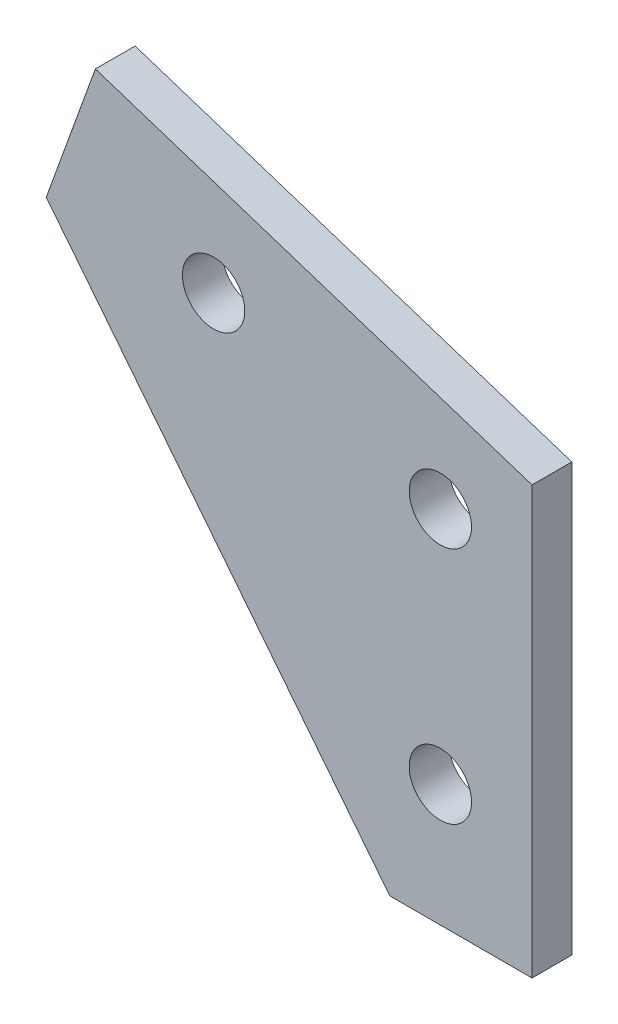
ISO-10303-21;
HEADER;
FILE_DESCRIPTION(('STEP AP214'),'2;1');
FILE_NAME('part.step','',(''),(''),'','','');
FILE_SCHEMA(('AUTOMOTIVE_DESIGN { 1 0 10303 214 1 1 1 1 }'));
ENDSEC;
DATA;
#1=APPLICATION_CONTEXT('core data for automotive mechanical design processes');
#2=APPLICATION_PROTOCOL_DEFINITION('international standard','automotive_design',2000,#1);
#3=PRODUCT_CONTEXT('',#1,'mechanical');
#4=PRODUCT('Part','Part','',(#3));
#5=PRODUCT_RELATED_PRODUCT_CATEGORY('part','',(#4));
#6=PRODUCT_DEFINITION_FORMATION('','',#4);
#7=PRODUCT_DEFINITION_CONTEXT('part definition',#1,'design');
#8=PRODUCT_DEFINITION('design','',#6,#7);
#9=PRODUCT_DEFINITION_SHAPE('','',#8);
#10=(LENGTH_UNIT() NAMED_UNIT(*) SI_UNIT(.MILLI.,.METRE.));
#11=(NAMED_UNIT(*) PLANE_ANGLE_UNIT() SI_UNIT($,.RADIAN.));
#12=(NAMED_UNIT(*) SI_UNIT($,.STERADIAN.) SOLID_ANGLE_UNIT());
#13=UNCERTAINTY_MEASURE_WITH_UNIT(LENGTH_MEASURE(1.E-05),#10,'distance_accuracy_value','');
#14=(GEOMETRIC_REPRESENTATION_CONTEXT(3) GLOBAL_UNCERTAINTY_ASSIGNED_CONTEXT((#13)) GLOBAL_UNIT_ASSIGNED_CONTEXT((#10,
#11,#12)) REPRESENTATION_CONTEXT('',''));
#15=CARTESIAN_POINT('',(0.,0.,0.));
#16=DIRECTION('',(0.,0.,1.));
#17=DIRECTION('',(1.,0.,0.));
#18=AXIS2_PLACEMENT_3D('',#15,#16,#17);
#19=CARTESIAN_POINT('',(-42.1877444020776,293.919732513961,3.175));
#20=DIRECTION('',(0.94025573839472,-0.340469009479278,0.));
#21=DIRECTION('',(0.340469009479278,0.94025573839472,0.));
#22=AXIS2_PLACEMENT_3D('',#19,#20,#21);
#23=PLANE('',#22);
#24=DIRECTION('',(-0.340469009479278,-0.94025573839472,0.));
#25=VECTOR('',#24,1.);
#26=CARTESIAN_POINT('',(-42.1877444020776,293.919732513961,0.));
#27=LINE('',#26,#25);
#28=CARTESIAN_POINT('',(-42.1877444020776,293.919732513961,0.));
#29=VERTEX_POINT('',#28);
#30=CARTESIAN_POINT('',(-46.1134447942971,283.078327809761,0.));
#31=VERTEX_POINT('',#30);
#32=EDGE_CURVE('E111',#29,#31,#27,.T.);
#33=ORIENTED_EDGE('',*,*,#32,.T.);
#34=DIRECTION('',(0.,0.,-1.));
#35=VECTOR('',#34,1.);
#36=CARTESIAN_POINT('',(-46.1134447942971,283.078327809761,3.175));
#37=LINE('',#36,#35);
#38=CARTESIAN_POINT('',(-46.1134447942971,283.078327809761,3.175));
#39=VERTEX_POINT('',#38);
#40=EDGE_CURVE('E11',#39,#31,#37,.T.);
#41=ORIENTED_EDGE('',*,*,#40,.F.);
#42=DIRECTION('',(-0.340469009479278,-0.94025573839472,0.));
#43=VECTOR('',#42,1.);
#44=CARTESIAN_POINT('',(-42.1877444020776,293.919732513961,3.175));
#45=LINE('',#44,#43);
#46=CARTESIAN_POINT('',(-42.1877444020776,293.919732513961,3.175));
#47=VERTEX_POINT('',#46);
#48=EDGE_CURVE('E120',#47,#39,#45,.T.);
#49=ORIENTED_EDGE('',*,*,#48,.F.);
#50=DIRECTION('',(0.,0.,-1.));
#51=VECTOR('',#50,1.);
#52=CARTESIAN_POINT('',(-42.1877444020776,293.919732513961,3.175));
#53=LINE('',#52,#51);
#54=EDGE_CURVE('E107',#47,#29,#53,.T.);
#55=ORIENTED_EDGE('',*,*,#54,.T.);
#56=EDGE_LOOP('',(#33,#41,#49,#55));
#57=FACE_BOUND('',#56,.T.);
#58=ADVANCED_FACE('F37',(#57),#23,.F.);
#59=CARTESIAN_POINT('',(-18.6536756946853,248.458198081122,3.175));
#60=DIRECTION('',(0.783470961767866,0.621428396572393,0.));
#61=DIRECTION('',(-0.621428396572393,0.783470961767866,0.));
#62=AXIS2_PLACEMENT_3D('',#59,#60,#61);
#63=PLANE('',#62);
#64=DIRECTION('',(0.621428396572393,-0.783470961767866,0.));
#65=VECTOR('',#64,1.);
#66=CARTESIAN_POINT('',(-18.6536756946853,248.458198081122,0.));
#67=LINE('',#66,#65);
#68=CARTESIAN_POINT('',(-18.6536756946853,248.458198081122,0.));
#69=VERTEX_POINT('',#68);
#70=EDGE_CURVE('E114',#31,#69,#67,.T.);
#71=ORIENTED_EDGE('',*,*,#70,.T.);
#72=DIRECTION('',(0.,0.,-1.));
#73=VECTOR('',#72,1.);
#74=CARTESIAN_POINT('',(-18.6536756946853,248.458198081122,3.175));
#75=LINE('',#74,#73);
#76=CARTESIAN_POINT('',(-18.6536756946853,248.458198081122,3.175));
#77=VERTEX_POINT('',#76);
#78=EDGE_CURVE('E45',#77,#69,#75,.T.);
#79=ORIENTED_EDGE('',*,*,#78,.F.);
#80=DIRECTION('',(0.621428396572393,-0.783470961767866,0.));
#81=VECTOR('',#80,1.);
#82=CARTESIAN_POINT('',(-18.6536756946853,248.458198081122,3.175));
#83=LINE('',#82,#81);
#84=EDGE_CURVE('E87',#39,#77,#83,.T.);
#85=ORIENTED_EDGE('',*,*,#84,.F.);
#86=ORIENTED_EDGE('',*,*,#40,.T.);
#87=EDGE_LOOP('',(#71,#79,#85,#86));
#88=FACE_BOUND('',#87,.T.);
#89=ADVANCED_FACE('F140',(#88),#63,.F.);
#90=CARTESIAN_POINT('',(-7.29698264863268,248.458198081122,3.175));
#91=DIRECTION('',(0.,1.,0.));
#92=DIRECTION('',(-1.,0.,0.));
#93=AXIS2_PLACEMENT_3D('',#90,#91,#92);
#94=PLANE('',#93);
#95=DIRECTION('',(1.,0.,0.));
#96=VECTOR('',#95,1.);
#97=CARTESIAN_POINT('',(-7.29698264863268,248.458198081122,0.));
#98=LINE('',#97,#96);
#99=CARTESIAN_POINT('',(-7.29698264863268,248.458198081122,0.));
#100=VERTEX_POINT('',#99);
#101=EDGE_CURVE('E102',#69,#100,#98,.T.);
#102=ORIENTED_EDGE('',*,*,#101,.T.);
#103=DIRECTION('',(0.,0.,-1.));
#104=VECTOR('',#103,1.);
#105=CARTESIAN_POINT('',(-7.29698264863268,248.458198081122,3.175));
#106=LINE('',#105,#104);
#107=CARTESIAN_POINT('',(-7.29698264863268,248.458198081122,3.175));
#108=VERTEX_POINT('',#107);
#109=EDGE_CURVE('E99',#108,#100,#106,.T.);
#110=ORIENTED_EDGE('',*,*,#109,.F.);
#111=DIRECTION('',(1.,0.,0.));
#112=VECTOR('',#111,1.);
#113=CARTESIAN_POINT('',(-7.29698264863268,248.458198081122,3.175));
#114=LINE('',#113,#112);
#115=EDGE_CURVE('E91',#77,#108,#114,.T.);
#116=ORIENTED_EDGE('',*,*,#115,.F.);
#117=ORIENTED_EDGE('',*,*,#78,.T.);
#118=EDGE_LOOP('',(#102,#110,#116,#117));
#119=FACE_BOUND('',#118,.T.);
#120=ADVANCED_FACE('F100',(#119),#94,.F.);
#121=CARTESIAN_POINT('',(-7.29698264863268,282.581513930959,3.175));
#122=DIRECTION('',(-1.,0.,0.));
#123=DIRECTION('',(0.,-1.,0.));
#124=AXIS2_PLACEMENT_3D('',#121,#122,#123);
#125=PLANE('',#124);
#126=DIRECTION('',(0.,1.,0.));
#127=VECTOR('',#126,1.);
#128=CARTESIAN_POINT('',(-7.29698264863268,282.581513930959,0.));
#129=LINE('',#128,#127);
#130=CARTESIAN_POINT('',(-7.29698264863268,282.581513930959,0.));
#131=VERTEX_POINT('',#130);
#132=EDGE_CURVE('E73',#100,#131,#129,.T.);
#133=ORIENTED_EDGE('',*,*,#132,.T.);
#134=DIRECTION('',(0.,0.,-1.));
#135=VECTOR('',#134,1.);
#136=CARTESIAN_POINT('',(-7.29698264863268,282.581513930959,3.175));
#137=LINE('',#136,#135);
#138=CARTESIAN_POINT('',(-7.29698264863268,282.581513930959,3.175));
#139=VERTEX_POINT('',#138);
#140=EDGE_CURVE('E103',#139,#131,#137,.T.);
#141=ORIENTED_EDGE('',*,*,#140,.F.);
#142=DIRECTION('',(0.,1.,0.));
#143=VECTOR('',#142,1.);
#144=CARTESIAN_POINT('',(-7.29698264863268,282.581513930959,3.175));
#145=LINE('',#144,#143);
#146=EDGE_CURVE('E95',#108,#139,#145,.T.);
#147=ORIENTED_EDGE('',*,*,#146,.F.);
#148=ORIENTED_EDGE('',*,*,#109,.T.);
#149=EDGE_LOOP('',(#133,#141,#147,#148));
#150=FACE_BOUND('',#149,.T.);
#151=ADVANCED_FACE('F105',(#150),#125,.F.);
#152=CARTESIAN_POINT('',(-42.1877444020776,293.919732513961,3.175));
#153=DIRECTION('',(-0.30905454038402,-0.951044316037913,0.));
#154=DIRECTION('',(0.951044316037913,-0.30905454038402,0.));
#155=AXIS2_PLACEMENT_3D('',#152,#153,#154);
#156=PLANE('',#155);
#157=DIRECTION('',(-0.951044316037913,0.30905454038402,0.));
#158=VECTOR('',#157,1.);
#159=CARTESIAN_POINT('',(-42.1877444020776,293.919732513961,0.));
#160=LINE('',#159,#158);
#161=EDGE_CURVE('E79',#131,#29,#160,.T.);
#162=ORIENTED_EDGE('',*,*,#161,.T.);
#163=ORIENTED_EDGE('',*,*,#54,.F.);
#164=DIRECTION('',(-0.951044316037913,0.30905454038402,0.));
#165=VECTOR('',#164,1.);
#166=CARTESIAN_POINT('',(-42.1877444020776,293.919732513961,3.175));
#167=LINE('',#166,#165);
#168=EDGE_CURVE('E53',#139,#47,#167,.T.);
#169=ORIENTED_EDGE('',*,*,#168,.F.);
#170=ORIENTED_EDGE('',*,*,#140,.T.);
#171=EDGE_LOOP('',(#162,#163,#169,#170));
#172=FACE_BOUND('',#171,.T.);
#173=ADVANCED_FACE('F128',(#172),#156,.F.);
#174=CARTESIAN_POINT('',(0.,0.,3.175));
#175=DIRECTION('',(0.,0.,1.));
#176=DIRECTION('',(1.,0.,0.));
#177=AXIS2_PLACEMENT_3D('',#174,#175,#176);
#178=PLANE('',#177);
#179=CARTESIAN_POINT('',(-32.7402519463279,283.138719962977,3.175));
#180=DIRECTION('',(0.,0.,1.));
#181=DIRECTION('',(1.,0.,0.));
#182=AXIS2_PLACEMENT_3D('',#179,#180,#181);
#183=CIRCLE('',#182,2.48919999999999);
#184=CARTESIAN_POINT('',(-30.2510519463279,283.138719962977,3.175));
#185=VERTEX_POINT('',#184);
#186=EDGE_CURVE('E242',#185,#185,#183,.T.);
#187=ORIENTED_EDGE('',*,*,#186,.F.);
#188=EDGE_LOOP('',(#187));
#189=FACE_BOUND('',#188,.T.);
#190=CARTESIAN_POINT('',(-14.6226253109059,277.251946220132,3.175));
#191=DIRECTION('',(0.,0.,1.));
#192=DIRECTION('',(1.,0.,0.));
#193=AXIS2_PLACEMENT_3D('',#190,#191,#192);
#194=CIRCLE('',#193,2.48919999999999);
#195=CARTESIAN_POINT('',(-12.1334253109059,277.251946220132,3.175));
#196=VERTEX_POINT('',#195);
#197=EDGE_CURVE('E244',#196,#196,#194,.T.);
#198=ORIENTED_EDGE('',*,*,#197,.F.);
#199=EDGE_LOOP('',(#198));
#200=FACE_BOUND('',#199,.T.);
#201=CARTESIAN_POINT('',(-14.6226253109059,258.201946220132,3.175));
#202=DIRECTION('',(0.,0.,1.));
#203=DIRECTION('',(1.,0.,0.));
#204=AXIS2_PLACEMENT_3D('',#201,#202,#203);
#205=CIRCLE('',#204,2.48919999999999);
#206=CARTESIAN_POINT('',(-12.133425310906,258.201946220132,3.175));
#207=VERTEX_POINT('',#206);
#208=EDGE_CURVE('E252',#207,#207,#205,.T.);
#209=ORIENTED_EDGE('',*,*,#208,.F.);
#210=EDGE_LOOP('',(#209));
#211=FACE_BOUND('',#210,.T.);
#212=ORIENTED_EDGE('',*,*,#48,.T.);
#213=ORIENTED_EDGE('',*,*,#84,.T.);
#214=ORIENTED_EDGE('',*,*,#115,.T.);
#215=ORIENTED_EDGE('',*,*,#146,.T.);
#216=ORIENTED_EDGE('',*,*,#168,.T.);
#217=EDGE_LOOP('',(#212,#213,#214,#215,#216));
#218=FACE_BOUND('',#217,.T.);
#219=ADVANCED_FACE('F93',(#189,#200,#211,#218),#178,.T.);
#220=CARTESIAN_POINT('',(0.,0.,0.));
#221=DIRECTION('',(0.,0.,1.));
#222=DIRECTION('',(1.,0.,0.));
#223=AXIS2_PLACEMENT_3D('',#220,#221,#222);
#224=PLANE('',#223);
#225=CARTESIAN_POINT('',(-32.7402519463279,283.138719962977,0.));
#226=DIRECTION('',(0.,0.,1.));
#227=DIRECTION('',(1.,0.,0.));
#228=AXIS2_PLACEMENT_3D('',#225,#226,#227);
#229=CIRCLE('',#228,2.4892);
#230=CARTESIAN_POINT('',(-30.2510519463279,283.138719962977,0.));
#231=VERTEX_POINT('',#230);
#232=EDGE_CURVE('E239',#231,#231,#229,.T.);
#233=ORIENTED_EDGE('',*,*,#232,.T.);
#234=EDGE_LOOP('',(#233));
#235=FACE_BOUND('',#234,.T.);
#236=CARTESIAN_POINT('',(-14.6226253109059,277.251946220132,0.));
#237=DIRECTION('',(0.,0.,1.));
#238=DIRECTION('',(1.,0.,0.));
#239=AXIS2_PLACEMENT_3D('',#236,#237,#238);
#240=CIRCLE('',#239,2.4892);
#241=CARTESIAN_POINT('',(-12.1334253109059,277.251946220132,0.));
#242=VERTEX_POINT('',#241);
#243=EDGE_CURVE('E249',#242,#242,#240,.T.);
#244=ORIENTED_EDGE('',*,*,#243,.T.);
#245=EDGE_LOOP('',(#244));
#246=FACE_BOUND('',#245,.T.);
#247=CARTESIAN_POINT('',(-14.6226253109059,258.201946220132,0.));
#248=DIRECTION('',(0.,0.,1.));
#249=DIRECTION('',(1.,0.,0.));
#250=AXIS2_PLACEMENT_3D('',#247,#248,#249);
#251=CIRCLE('',#250,2.4892);
#252=CARTESIAN_POINT('',(-12.1334253109059,258.201946220132,0.));
#253=VERTEX_POINT('',#252);
#254=EDGE_CURVE('E115',#253,#253,#251,.T.);
#255=ORIENTED_EDGE('',*,*,#254,.T.);
#256=EDGE_LOOP('',(#255));
#257=FACE_BOUND('',#256,.T.);
#258=ORIENTED_EDGE('',*,*,#32,.F.);
#259=ORIENTED_EDGE('',*,*,#161,.F.);
#260=ORIENTED_EDGE('',*,*,#132,.F.);
#261=ORIENTED_EDGE('',*,*,#101,.F.);
#262=ORIENTED_EDGE('',*,*,#70,.F.);
#263=EDGE_LOOP('',(#258,#259,#260,#261,#262));
#264=FACE_BOUND('',#263,.T.);
#265=ADVANCED_FACE('F124',(#235,#246,#257,#264),#224,.F.);
#266=CARTESIAN_POINT('',(-14.6226253109059,258.201946220132,3.175));
#267=DIRECTION('',(0.,0.,1.));
#268=DIRECTION('',(1.,0.,0.));
#269=AXIS2_PLACEMENT_3D('',#266,#267,#268);
#270=CYLINDRICAL_SURFACE('',#269,2.48919999999999);
#271=ORIENTED_EDGE('',*,*,#254,.F.);
#272=EDGE_LOOP('',(#271));
#273=FACE_BOUND('',#272,.T.);
#274=ORIENTED_EDGE('',*,*,#208,.T.);
#275=EDGE_LOOP('',(#274));
#276=FACE_BOUND('',#275,.T.);
#277=ADVANCED_FACE('F176',(#273,#276),#270,.F.);
#278=CARTESIAN_POINT('',(-14.6226253109059,277.251946220132,3.175));
#279=DIRECTION('',(0.,0.,1.));
#280=DIRECTION('',(1.,0.,0.));
#281=AXIS2_PLACEMENT_3D('',#278,#279,#280);
#282=CYLINDRICAL_SURFACE('',#281,2.48919999999999);
#283=ORIENTED_EDGE('',*,*,#243,.F.);
#284=EDGE_LOOP('',(#283));
#285=FACE_BOUND('',#284,.T.);
#286=ORIENTED_EDGE('',*,*,#197,.T.);
#287=EDGE_LOOP('',(#286));
#288=FACE_BOUND('',#287,.T.);
#289=ADVANCED_FACE('F186',(#285,#288),#282,.F.);
#290=CARTESIAN_POINT('',(-32.7402519463279,283.138719962977,3.175));
#291=DIRECTION('',(0.,0.,1.));
#292=DIRECTION('',(1.,0.,0.));
#293=AXIS2_PLACEMENT_3D('',#290,#291,#292);
#294=CYLINDRICAL_SURFACE('',#293,2.4892);
#295=ORIENTED_EDGE('',*,*,#232,.F.);
#296=EDGE_LOOP('',(#295));
#297=FACE_BOUND('',#296,.T.);
#298=ORIENTED_EDGE('',*,*,#186,.T.);
#299=EDGE_LOOP('',(#298));
#300=FACE_BOUND('',#299,.T.);
#301=ADVANCED_FACE('F197',(#297,#300),#294,.F.);
#302=CLOSED_SHELL('',(#58,#89,#120,#151,#173,#219,#265,#277,#289,#301));
#303=MANIFOLD_SOLID_BREP('B2',#302);
#304=ADVANCED_BREP_SHAPE_REPRESENTATION('',(#18,#303),#14);
#305=SHAPE_DEFINITION_REPRESENTATION(#9,#304);
ENDSEC;
END-ISO-10303-21;
